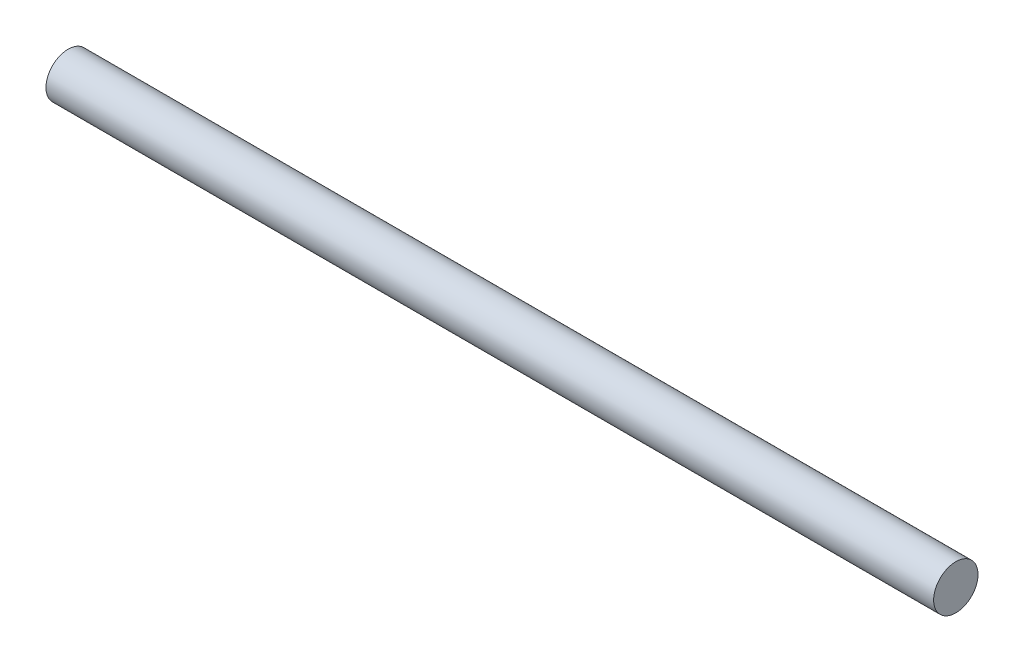
ISO-10303-21;
HEADER;
FILE_DESCRIPTION(('STEP AP214'),'2;1');
FILE_NAME('part.step','',(''),(''),'','','');
FILE_SCHEMA(('AUTOMOTIVE_DESIGN { 1 0 10303 214 1 1 1 1 }'));
ENDSEC;
DATA;
#1=APPLICATION_CONTEXT('core data for automotive mechanical design processes');
#2=APPLICATION_PROTOCOL_DEFINITION('international standard','automotive_design',2000,#1);
#3=PRODUCT_CONTEXT('',#1,'mechanical');
#4=PRODUCT('Part','Part','',(#3));
#5=PRODUCT_RELATED_PRODUCT_CATEGORY('part','',(#4));
#6=PRODUCT_DEFINITION_FORMATION('','',#4);
#7=PRODUCT_DEFINITION_CONTEXT('part definition',#1,'design');
#8=PRODUCT_DEFINITION('design','',#6,#7);
#9=PRODUCT_DEFINITION_SHAPE('','',#8);
#10=(LENGTH_UNIT() NAMED_UNIT(*) SI_UNIT(.MILLI.,.METRE.));
#11=(NAMED_UNIT(*) PLANE_ANGLE_UNIT() SI_UNIT($,.RADIAN.));
#12=(NAMED_UNIT(*) SI_UNIT($,.STERADIAN.) SOLID_ANGLE_UNIT());
#13=UNCERTAINTY_MEASURE_WITH_UNIT(LENGTH_MEASURE(1.E-05),#10,'distance_accuracy_value','');
#14=(GEOMETRIC_REPRESENTATION_CONTEXT(3) GLOBAL_UNCERTAINTY_ASSIGNED_CONTEXT((#13)) GLOBAL_UNIT_ASSIGNED_CONTEXT((#10,
#11,#12)) REPRESENTATION_CONTEXT('',''));
#15=CARTESIAN_POINT('',(0.,0.,0.));
#16=DIRECTION('',(0.,0.,1.));
#17=DIRECTION('',(1.,0.,0.));
#18=AXIS2_PLACEMENT_3D('',#15,#16,#17);
#19=CARTESIAN_POINT('',(2.,0.,0.));
#20=DIRECTION('',(-1.,0.,0.));
#21=DIRECTION('',(0.,0.,1.));
#22=AXIS2_PLACEMENT_3D('',#19,#20,#21);
#23=CYLINDRICAL_SURFACE('',#22,0.0499999999999997);
#24=CARTESIAN_POINT('',(2.,0.,0.));
#25=DIRECTION('',(1.,0.,0.));
#26=DIRECTION('',(0.,0.,-1.));
#27=AXIS2_PLACEMENT_3D('',#24,#25,#26);
#28=CIRCLE('',#27,0.0499999999999997);
#29=CARTESIAN_POINT('',(2.,0.,-0.0499999999999997));
#30=VERTEX_POINT('',#29);
#31=EDGE_CURVE('E10',#30,#30,#28,.T.);
#32=ORIENTED_EDGE('',*,*,#31,.F.);
#33=EDGE_LOOP('',(#32));
#34=FACE_BOUND('',#33,.T.);
#35=CARTESIAN_POINT('',(0.,0.,0.));
#36=DIRECTION('',(1.,0.,0.));
#37=DIRECTION('',(0.,0.,-1.));
#38=AXIS2_PLACEMENT_3D('',#35,#36,#37);
#39=CIRCLE('',#38,0.0499999999999997);
#40=CARTESIAN_POINT('',(0.,0.,-0.0499999999999997));
#41=VERTEX_POINT('',#40);
#42=EDGE_CURVE('E34',#41,#41,#39,.T.);
#43=ORIENTED_EDGE('',*,*,#42,.T.);
#44=EDGE_LOOP('',(#43));
#45=FACE_BOUND('',#44,.T.);
#46=ADVANCED_FACE('F31',(#34,#45),#23,.T.);
#47=CARTESIAN_POINT('',(2.,0.,0.));
#48=DIRECTION('',(1.,0.,0.));
#49=DIRECTION('',(0.,0.,-1.));
#50=AXIS2_PLACEMENT_3D('',#47,#48,#49);
#51=PLANE('',#50);
#52=ORIENTED_EDGE('',*,*,#31,.T.);
#53=EDGE_LOOP('',(#52));
#54=FACE_BOUND('',#53,.T.);
#55=ADVANCED_FACE('F46',(#54),#51,.T.);
#56=CARTESIAN_POINT('',(0.,0.,0.));
#57=DIRECTION('',(1.,0.,0.));
#58=DIRECTION('',(0.,0.,-1.));
#59=AXIS2_PLACEMENT_3D('',#56,#57,#58);
#60=PLANE('',#59);
#61=ORIENTED_EDGE('',*,*,#42,.F.);
#62=EDGE_LOOP('',(#61));
#63=FACE_BOUND('',#62,.T.);
#64=ADVANCED_FACE('F44',(#63),#60,.F.);
#65=CLOSED_SHELL('',(#46,#55,#64));
#66=MANIFOLD_SOLID_BREP('B2',#65);
#67=ADVANCED_BREP_SHAPE_REPRESENTATION('',(#18,#66),#14);
#68=SHAPE_DEFINITION_REPRESENTATION(#9,#67);
ENDSEC;
END-ISO-10303-21;
